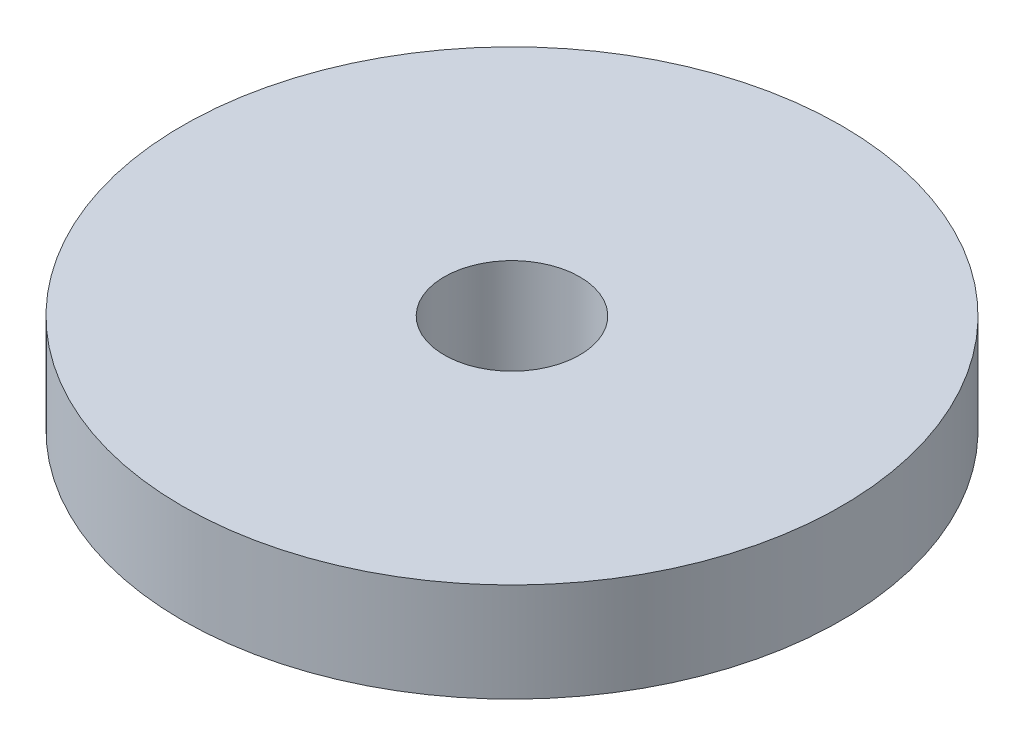
ISO-10303-21;
HEADER;
FILE_DESCRIPTION(('STEP AP214'),'2;1');
FILE_NAME('part.step','',(''),(''),'','','');
FILE_SCHEMA(('AUTOMOTIVE_DESIGN { 1 0 10303 214 1 1 1 1 }'));
ENDSEC;
DATA;
#1=APPLICATION_CONTEXT('core data for automotive mechanical design processes');
#2=APPLICATION_PROTOCOL_DEFINITION('international standard','automotive_design',2000,#1);
#3=PRODUCT_CONTEXT('',#1,'mechanical');
#4=PRODUCT('Part','Part','',(#3));
#5=PRODUCT_RELATED_PRODUCT_CATEGORY('part','',(#4));
#6=PRODUCT_DEFINITION_FORMATION('','',#4);
#7=PRODUCT_DEFINITION_CONTEXT('part definition',#1,'design');
#8=PRODUCT_DEFINITION('design','',#6,#7);
#9=PRODUCT_DEFINITION_SHAPE('','',#8);
#10=(LENGTH_UNIT() NAMED_UNIT(*) SI_UNIT(.MILLI.,.METRE.));
#11=(NAMED_UNIT(*) PLANE_ANGLE_UNIT() SI_UNIT($,.RADIAN.));
#12=(NAMED_UNIT(*) SI_UNIT($,.STERADIAN.) SOLID_ANGLE_UNIT());
#13=UNCERTAINTY_MEASURE_WITH_UNIT(LENGTH_MEASURE(1.E-05),#10,'distance_accuracy_value','');
#14=(GEOMETRIC_REPRESENTATION_CONTEXT(3) GLOBAL_UNCERTAINTY_ASSIGNED_CONTEXT((#13)) GLOBAL_UNIT_ASSIGNED_CONTEXT((#10,
#11,#12)) REPRESENTATION_CONTEXT('',''));
#15=CARTESIAN_POINT('',(0.,0.,0.));
#16=DIRECTION('',(0.,0.,1.));
#17=DIRECTION('',(1.,0.,0.));
#18=AXIS2_PLACEMENT_3D('',#15,#16,#17);
#19=CARTESIAN_POINT('',(0.,4.7625,0.));
#20=DIRECTION('',(0.,1.,0.));
#21=DIRECTION('',(0.,0.,1.));
#22=AXIS2_PLACEMENT_3D('',#19,#20,#21);
#23=PLANE('',#22);
#24=CARTESIAN_POINT('',(0.,4.7625,0.));
#25=DIRECTION('',(0.,1.,0.));
#26=DIRECTION('',(0.,0.,1.));
#27=AXIS2_PLACEMENT_3D('',#24,#25,#26);
#28=CIRCLE('',#27,15.875);
#29=CARTESIAN_POINT('',(0.,4.7625,-15.875));
#30=VERTEX_POINT('',#29);
#31=EDGE_CURVE('E10',#30,#30,#28,.T.);
#32=ORIENTED_EDGE('',*,*,#31,.T.);
#33=EDGE_LOOP('',(#32));
#34=FACE_BOUND('',#33,.T.);
#35=CARTESIAN_POINT('',(0.,4.7625,0.));
#36=DIRECTION('',(0.,1.,0.));
#37=DIRECTION('',(0.,0.,1.));
#38=AXIS2_PLACEMENT_3D('',#35,#36,#37);
#39=CIRCLE('',#38,3.2639);
#40=CARTESIAN_POINT('',(0.,4.7625,-3.2639));
#41=VERTEX_POINT('',#40);
#42=EDGE_CURVE('E48',#41,#41,#39,.T.);
#43=ORIENTED_EDGE('',*,*,#42,.F.);
#44=EDGE_LOOP('',(#43));
#45=FACE_BOUND('',#44,.T.);
#46=ADVANCED_FACE('F37',(#34,#45),#23,.T.);
#47=CARTESIAN_POINT('',(0.,0.,0.));
#48=DIRECTION('',(0.,1.,0.));
#49=DIRECTION('',(0.,0.,1.));
#50=AXIS2_PLACEMENT_3D('',#47,#48,#49);
#51=PLANE('',#50);
#52=CARTESIAN_POINT('',(0.,0.,0.));
#53=DIRECTION('',(0.,1.,0.));
#54=DIRECTION('',(0.,0.,1.));
#55=AXIS2_PLACEMENT_3D('',#52,#53,#54);
#56=CIRCLE('',#55,15.875);
#57=CARTESIAN_POINT('',(0.,0.,-15.875));
#58=VERTEX_POINT('',#57);
#59=EDGE_CURVE('E41',#58,#58,#56,.T.);
#60=ORIENTED_EDGE('',*,*,#59,.F.);
#61=EDGE_LOOP('',(#60));
#62=FACE_BOUND('',#61,.T.);
#63=CARTESIAN_POINT('',(0.,0.,0.));
#64=DIRECTION('',(0.,1.,0.));
#65=DIRECTION('',(0.,0.,1.));
#66=AXIS2_PLACEMENT_3D('',#63,#64,#65);
#67=CIRCLE('',#66,3.2639);
#68=CARTESIAN_POINT('',(0.,0.,-3.2639));
#69=VERTEX_POINT('',#68);
#70=EDGE_CURVE('E50',#69,#69,#67,.T.);
#71=ORIENTED_EDGE('',*,*,#70,.T.);
#72=EDGE_LOOP('',(#71));
#73=FACE_BOUND('',#72,.T.);
#74=ADVANCED_FACE('F60',(#62,#73),#51,.F.);
#75=CARTESIAN_POINT('',(0.,4.7625,0.));
#76=DIRECTION('',(0.,-1.,0.));
#77=DIRECTION('',(0.,0.,-1.));
#78=AXIS2_PLACEMENT_3D('',#75,#76,#77);
#79=CYLINDRICAL_SURFACE('',#78,15.875);
#80=CARTESIAN_POINT('',(0.,4.7625,-15.875));
#81=CARTESIAN_POINT('',(0.,4.712890625,-15.875));
#82=CARTESIAN_POINT('',(0.,4.66328125,-15.875));
#83=CARTESIAN_POINT('',(0.,4.5640625,-15.875));
#84=CARTESIAN_POINT('',(0.,4.514453125,-15.875));
#85=CARTESIAN_POINT('',(0.,4.415234375,-15.875));
#86=CARTESIAN_POINT('',(0.,4.365625,-15.875));
#87=CARTESIAN_POINT('',(0.,4.26640625,-15.875));
#88=CARTESIAN_POINT('',(0.,4.216796875,-15.875));
#89=CARTESIAN_POINT('',(0.,4.117578125,-15.875));
#90=CARTESIAN_POINT('',(0.,4.06796875,-15.875));
#91=CARTESIAN_POINT('',(0.,3.96875,-15.875));
#92=CARTESIAN_POINT('',(0.,3.919140625,-15.875));
#93=CARTESIAN_POINT('',(0.,3.819921875,-15.875));
#94=CARTESIAN_POINT('',(0.,3.7703125,-15.875));
#95=CARTESIAN_POINT('',(0.,3.67109375,-15.875));
#96=CARTESIAN_POINT('',(0.,3.621484375,-15.875));
#97=CARTESIAN_POINT('',(0.,3.522265625,-15.875));
#98=CARTESIAN_POINT('',(0.,3.47265625,-15.875));
#99=CARTESIAN_POINT('',(0.,3.3734375,-15.875));
#100=CARTESIAN_POINT('',(0.,3.323828125,-15.875));
#101=CARTESIAN_POINT('',(0.,3.224609375,-15.875));
#102=CARTESIAN_POINT('',(0.,3.175,-15.875));
#103=CARTESIAN_POINT('',(0.,3.07578125,-15.875));
#104=CARTESIAN_POINT('',(0.,3.026171875,-15.875));
#105=CARTESIAN_POINT('',(0.,2.926953125,-15.875));
#106=CARTESIAN_POINT('',(0.,2.87734375,-15.875));
#107=CARTESIAN_POINT('',(0.,2.778125,-15.875));
#108=CARTESIAN_POINT('',(0.,2.728515625,-15.875));
#109=CARTESIAN_POINT('',(0.,2.629296875,-15.875));
#110=CARTESIAN_POINT('',(0.,2.5796875,-15.875));
#111=CARTESIAN_POINT('',(0.,2.48046875,-15.875));
#112=CARTESIAN_POINT('',(0.,2.430859375,-15.875));
#113=CARTESIAN_POINT('',(0.,2.331640625,-15.875));
#114=CARTESIAN_POINT('',(0.,2.28203125,-15.875));
#115=CARTESIAN_POINT('',(0.,2.1828125,-15.875));
#116=CARTESIAN_POINT('',(0.,2.133203125,-15.875));
#117=CARTESIAN_POINT('',(0.,2.033984375,-15.875));
#118=CARTESIAN_POINT('',(0.,1.984375,-15.875));
#119=CARTESIAN_POINT('',(0.,1.88515625,-15.875));
#120=CARTESIAN_POINT('',(0.,1.835546875,-15.875));
#121=CARTESIAN_POINT('',(0.,1.736328125,-15.875));
#122=CARTESIAN_POINT('',(0.,1.68671875,-15.875));
#123=CARTESIAN_POINT('',(0.,1.5875,-15.875));
#124=CARTESIAN_POINT('',(0.,1.537890625,-15.875));
#125=CARTESIAN_POINT('',(0.,1.438671875,-15.875));
#126=CARTESIAN_POINT('',(0.,1.3890625,-15.875));
#127=CARTESIAN_POINT('',(0.,1.28984375,-15.875));
#128=CARTESIAN_POINT('',(0.,1.240234375,-15.875));
#129=CARTESIAN_POINT('',(0.,1.141015625,-15.875));
#130=CARTESIAN_POINT('',(0.,1.09140625,-15.875));
#131=CARTESIAN_POINT('',(0.,0.992187499999999,-15.875));
#132=CARTESIAN_POINT('',(0.,0.942578124999999,-15.875));
#133=CARTESIAN_POINT('',(0.,0.843359375,-15.875));
#134=CARTESIAN_POINT('',(0.,0.79375,-15.875));
#135=CARTESIAN_POINT('',(0.,0.69453125,-15.875));
#136=CARTESIAN_POINT('',(0.,0.644921875,-15.875));
#137=CARTESIAN_POINT('',(0.,0.545703125,-15.875));
#138=CARTESIAN_POINT('',(0.,0.49609375,-15.875));
#139=CARTESIAN_POINT('',(0.,0.396875,-15.875));
#140=CARTESIAN_POINT('',(0.,0.347265625,-15.875));
#141=CARTESIAN_POINT('',(0.,0.248046875,-15.875));
#142=CARTESIAN_POINT('',(0.,0.1984375,-15.875));
#143=CARTESIAN_POINT('',(0.,0.09921875,-15.875));
#144=CARTESIAN_POINT('',(0.,0.049609375,-15.875));
#145=CARTESIAN_POINT('',(0.,0.,-15.875));
#146=B_SPLINE_CURVE_WITH_KNOTS('',3,(#80,#81,#82,#83,#84,#85,#86,#87,#88,#89,#90,#91,#92,#93,
#94,#95,#96,#97,#98,#99,#100,#101,#102,#103,#104,#105,#106,#107,#108,#109,#110,#111,#112,#113,
#114,#115,#116,#117,#118,#119,#120,#121,#122,#123,#124,#125,#126,#127,#128,#129,#130,#131,#132,
#133,#134,#135,#136,#137,#138,#139,#140,#141,#142,#143,#144,#145),.UNSPECIFIED.,.F.,.F.,(4,2,2,
2,2,2,2,2,2,2,2,2,2,2,2,2,2,2,2,2,2,2,2,2,2,2,2,2,2,2,2,2,4),(0.,0.148828125,0.29765625,
0.446484375,0.5953125,0.744140625,0.892968750000001,1.041796875,1.190625,1.339453125,1.48828125,
1.637109375,1.7859375,1.934765625,2.08359375,2.232421875,2.38125,2.530078125,2.67890625,
2.827734375,2.9765625,3.125390625,3.27421875,3.423046875,3.571875,3.720703125,3.86953125,
4.018359375,4.1671875,4.316015625,4.46484375,4.613671875,4.7625),.UNSPECIFIED.);
#147=EDGE_CURVE('BSEAM39',#30,#58,#146,.T.);
#148=ORIENTED_EDGE('',*,*,#31,.F.);
#149=ORIENTED_EDGE('',*,*,#59,.T.);
#150=ORIENTED_EDGE('',*,*,#147,.T.);
#151=ORIENTED_EDGE('',*,*,#147,.F.);
#152=EDGE_LOOP('',(#148,#150,#149,#151));
#153=FACE_BOUND('',#152,.T.);
#154=ADVANCED_FACE('F39',(#153),#79,.T.);
#155=CARTESIAN_POINT('',(0.,4.7625,0.));
#156=DIRECTION('',(0.,-1.,0.));
#157=DIRECTION('',(0.,0.,-1.));
#158=AXIS2_PLACEMENT_3D('',#155,#156,#157);
#159=CYLINDRICAL_SURFACE('',#158,3.2639);
#160=CARTESIAN_POINT('',(0.,4.7625,-3.2639));
#161=CARTESIAN_POINT('',(0.,4.712890625,-3.2639));
#162=CARTESIAN_POINT('',(0.,4.66328125,-3.2639));
#163=CARTESIAN_POINT('',(0.,4.5640625,-3.2639));
#164=CARTESIAN_POINT('',(0.,4.514453125,-3.2639));
#165=CARTESIAN_POINT('',(0.,4.415234375,-3.2639));
#166=CARTESIAN_POINT('',(0.,4.365625,-3.2639));
#167=CARTESIAN_POINT('',(0.,4.26640625,-3.2639));
#168=CARTESIAN_POINT('',(0.,4.216796875,-3.2639));
#169=CARTESIAN_POINT('',(0.,4.117578125,-3.2639));
#170=CARTESIAN_POINT('',(0.,4.06796875,-3.2639));
#171=CARTESIAN_POINT('',(0.,3.96875,-3.2639));
#172=CARTESIAN_POINT('',(0.,3.919140625,-3.2639));
#173=CARTESIAN_POINT('',(0.,3.819921875,-3.2639));
#174=CARTESIAN_POINT('',(0.,3.7703125,-3.2639));
#175=CARTESIAN_POINT('',(0.,3.67109375,-3.2639));
#176=CARTESIAN_POINT('',(0.,3.621484375,-3.2639));
#177=CARTESIAN_POINT('',(0.,3.522265625,-3.2639));
#178=CARTESIAN_POINT('',(0.,3.47265625,-3.2639));
#179=CARTESIAN_POINT('',(0.,3.3734375,-3.2639));
#180=CARTESIAN_POINT('',(0.,3.323828125,-3.2639));
#181=CARTESIAN_POINT('',(0.,3.224609375,-3.2639));
#182=CARTESIAN_POINT('',(0.,3.175,-3.2639));
#183=CARTESIAN_POINT('',(0.,3.07578125,-3.2639));
#184=CARTESIAN_POINT('',(0.,3.026171875,-3.2639));
#185=CARTESIAN_POINT('',(0.,2.926953125,-3.2639));
#186=CARTESIAN_POINT('',(0.,2.87734375,-3.2639));
#187=CARTESIAN_POINT('',(0.,2.778125,-3.2639));
#188=CARTESIAN_POINT('',(0.,2.728515625,-3.2639));
#189=CARTESIAN_POINT('',(0.,2.629296875,-3.2639));
#190=CARTESIAN_POINT('',(0.,2.5796875,-3.2639));
#191=CARTESIAN_POINT('',(0.,2.48046875,-3.2639));
#192=CARTESIAN_POINT('',(0.,2.430859375,-3.2639));
#193=CARTESIAN_POINT('',(0.,2.331640625,-3.2639));
#194=CARTESIAN_POINT('',(0.,2.28203125,-3.2639));
#195=CARTESIAN_POINT('',(0.,2.1828125,-3.2639));
#196=CARTESIAN_POINT('',(0.,2.133203125,-3.2639));
#197=CARTESIAN_POINT('',(0.,2.033984375,-3.2639));
#198=CARTESIAN_POINT('',(0.,1.984375,-3.2639));
#199=CARTESIAN_POINT('',(0.,1.88515625,-3.2639));
#200=CARTESIAN_POINT('',(0.,1.835546875,-3.2639));
#201=CARTESIAN_POINT('',(0.,1.736328125,-3.2639));
#202=CARTESIAN_POINT('',(0.,1.68671875,-3.2639));
#203=CARTESIAN_POINT('',(0.,1.5875,-3.2639));
#204=CARTESIAN_POINT('',(0.,1.537890625,-3.2639));
#205=CARTESIAN_POINT('',(0.,1.438671875,-3.2639));
#206=CARTESIAN_POINT('',(0.,1.3890625,-3.2639));
#207=CARTESIAN_POINT('',(0.,1.28984375,-3.2639));
#208=CARTESIAN_POINT('',(0.,1.240234375,-3.2639));
#209=CARTESIAN_POINT('',(0.,1.141015625,-3.2639));
#210=CARTESIAN_POINT('',(0.,1.09140625,-3.2639));
#211=CARTESIAN_POINT('',(0.,0.9921875,-3.2639));
#212=CARTESIAN_POINT('',(0.,0.942578125,-3.2639));
#213=CARTESIAN_POINT('',(0.,0.843359375,-3.2639));
#214=CARTESIAN_POINT('',(0.,0.79375,-3.2639));
#215=CARTESIAN_POINT('',(0.,0.69453125,-3.2639));
#216=CARTESIAN_POINT('',(0.,0.644921875,-3.2639));
#217=CARTESIAN_POINT('',(0.,0.545703125,-3.2639));
#218=CARTESIAN_POINT('',(0.,0.49609375,-3.2639));
#219=CARTESIAN_POINT('',(0.,0.396875,-3.2639));
#220=CARTESIAN_POINT('',(0.,0.347265625,-3.2639));
#221=CARTESIAN_POINT('',(0.,0.248046875,-3.2639));
#222=CARTESIAN_POINT('',(0.,0.1984375,-3.2639));
#223=CARTESIAN_POINT('',(0.,0.09921875,-3.2639));
#224=CARTESIAN_POINT('',(0.,0.049609375,-3.2639));
#225=CARTESIAN_POINT('',(0.,0.,-3.2639));
#226=B_SPLINE_CURVE_WITH_KNOTS('',3,(#160,#161,#162,#163,#164,#165,#166,#167,#168,#169,#170,
#171,#172,#173,#174,#175,#176,#177,#178,#179,#180,#181,#182,#183,#184,#185,#186,#187,#188,#189,
#190,#191,#192,#193,#194,#195,#196,#197,#198,#199,#200,#201,#202,#203,#204,#205,#206,#207,#208,
#209,#210,#211,#212,#213,#214,#215,#216,#217,#218,#219,#220,#221,#222,#223,#224,#225),
.UNSPECIFIED.,.F.,.F.,(4,2,2,2,2,2,2,2,2,2,2,2,2,2,2,2,2,2,2,2,2,2,2,2,2,2,2,2,2,2,2,2,4),(0.,
0.148828124999999,0.297656249999999,0.446484374999999,0.595312499999999,0.744140625,0.89296875,
1.041796875,1.190625,1.339453125,1.48828125,1.637109375,1.7859375,1.934765625,2.08359375,
2.232421875,2.38125,2.530078125,2.67890625,2.827734375,2.9765625,3.125390625,3.27421875,
3.423046875,3.571875,3.720703125,3.86953125,4.018359375,4.1671875,4.316015625,4.46484375,
4.613671875,4.7625),.UNSPECIFIED.);
#227=EDGE_CURVE('BSEAM56',#41,#69,#226,.T.);
#228=ORIENTED_EDGE('',*,*,#42,.T.);
#229=ORIENTED_EDGE('',*,*,#70,.F.);
#230=ORIENTED_EDGE('',*,*,#227,.T.);
#231=ORIENTED_EDGE('',*,*,#227,.F.);
#232=EDGE_LOOP('',(#228,#230,#229,#231));
#233=FACE_BOUND('',#232,.T.);
#234=ADVANCED_FACE('F56',(#233),#159,.F.);
#235=CLOSED_SHELL('',(#46,#74,#154,#234));
#236=MANIFOLD_SOLID_BREP('B2',#235);
#237=ADVANCED_BREP_SHAPE_REPRESENTATION('',(#18,#236),#14);
#238=SHAPE_DEFINITION_REPRESENTATION(#9,#237);
ENDSEC;
END-ISO-10303-21;
